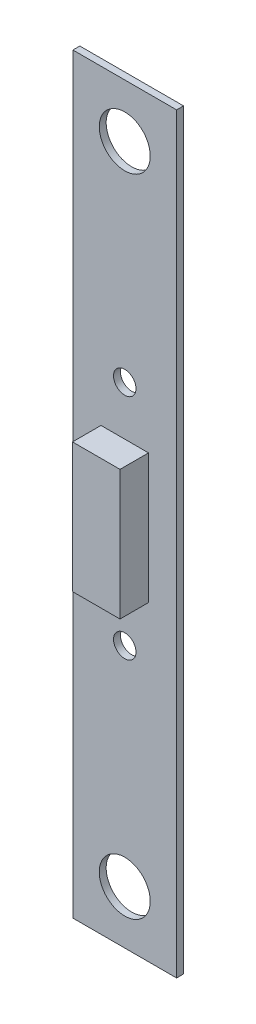
ISO-10303-21;
HEADER;
FILE_DESCRIPTION(('STEP AP214'),'2;1');
FILE_NAME('part.step','',(''),(''),'','','');
FILE_SCHEMA(('AUTOMOTIVE_DESIGN { 1 0 10303 214 1 1 1 1 }'));
ENDSEC;
DATA;
#1=APPLICATION_CONTEXT('core data for automotive mechanical design processes');
#2=APPLICATION_PROTOCOL_DEFINITION('international standard','automotive_design',2000,#1);
#3=PRODUCT_CONTEXT('',#1,'mechanical');
#4=PRODUCT('Part','Part','',(#3));
#5=PRODUCT_RELATED_PRODUCT_CATEGORY('part','',(#4));
#6=PRODUCT_DEFINITION_FORMATION('','',#4);
#7=PRODUCT_DEFINITION_CONTEXT('part definition',#1,'design');
#8=PRODUCT_DEFINITION('design','',#6,#7);
#9=PRODUCT_DEFINITION_SHAPE('','',#8);
#10=(LENGTH_UNIT() NAMED_UNIT(*) SI_UNIT(.MILLI.,.METRE.));
#11=(NAMED_UNIT(*) PLANE_ANGLE_UNIT() SI_UNIT($,.RADIAN.));
#12=(NAMED_UNIT(*) SI_UNIT($,.STERADIAN.) SOLID_ANGLE_UNIT());
#13=UNCERTAINTY_MEASURE_WITH_UNIT(LENGTH_MEASURE(1.E-05),#10,'distance_accuracy_value','');
#14=(GEOMETRIC_REPRESENTATION_CONTEXT(3) GLOBAL_UNCERTAINTY_ASSIGNED_CONTEXT((#13)) GLOBAL_UNIT_ASSIGNED_CONTEXT((#10,
#11,#12)) REPRESENTATION_CONTEXT('',''));
#15=CARTESIAN_POINT('',(0.,0.,0.));
#16=DIRECTION('',(0.,0.,1.));
#17=DIRECTION('',(1.,0.,0.));
#18=AXIS2_PLACEMENT_3D('',#15,#16,#17);
#19=CARTESIAN_POINT('',(0.,0.,4.1));
#20=DIRECTION('',(0.,0.,1.));
#21=DIRECTION('',(1.,0.,0.));
#22=AXIS2_PLACEMENT_3D('',#19,#20,#21);
#23=PLANE('',#22);
#24=DIRECTION('',(0.,1.,0.));
#25=VECTOR('',#24,1.);
#26=CARTESIAN_POINT('',(-2.75,7.5,4.1));
#27=LINE('',#26,#25);
#28=CARTESIAN_POINT('',(-2.75,-7.5,4.1));
#29=VERTEX_POINT('',#28);
#30=CARTESIAN_POINT('',(-2.75,7.5,4.1));
#31=VERTEX_POINT('',#30);
#32=EDGE_CURVE('E92',#29,#31,#27,.T.);
#33=ORIENTED_EDGE('',*,*,#32,.F.);
#34=DIRECTION('',(1.,0.,0.));
#35=VECTOR('',#34,1.);
#36=CARTESIAN_POINT('',(-2.75,-7.5,4.1));
#37=LINE('',#36,#35);
#38=CARTESIAN_POINT('',(2.75,-7.5,4.1));
#39=VERTEX_POINT('',#38);
#40=EDGE_CURVE('E172',#39,#29,#37,.F.);
#41=ORIENTED_EDGE('',*,*,#40,.F.);
#42=DIRECTION('',(0.,1.,0.));
#43=VECTOR('',#42,1.);
#44=CARTESIAN_POINT('',(2.75,-7.5,4.1));
#45=LINE('',#44,#43);
#46=CARTESIAN_POINT('',(2.75,7.5,4.1));
#47=VERTEX_POINT('',#46);
#48=EDGE_CURVE('E106',#47,#39,#45,.F.);
#49=ORIENTED_EDGE('',*,*,#48,.F.);
#50=DIRECTION('',(1.,0.,0.));
#51=VECTOR('',#50,1.);
#52=CARTESIAN_POINT('',(2.75,7.5,4.1));
#53=LINE('',#52,#51);
#54=EDGE_CURVE('E85',#31,#47,#53,.T.);
#55=ORIENTED_EDGE('',*,*,#54,.F.);
#56=EDGE_LOOP('',(#33,#41,#49,#55));
#57=FACE_BOUND('',#56,.T.);
#58=ADVANCED_FACE('F17',(#57),#23,.T.);
#59=CARTESIAN_POINT('',(-2.75,7.5,0.8));
#60=DIRECTION('',(-1.,0.,0.));
#61=DIRECTION('',(0.,0.,1.));
#62=AXIS2_PLACEMENT_3D('',#59,#60,#61);
#63=PLANE('',#62);
#64=DIRECTION('',(0.,0.,1.));
#65=VECTOR('',#64,1.);
#66=CARTESIAN_POINT('',(-2.75,7.5,0.8));
#67=LINE('',#66,#65);
#68=CARTESIAN_POINT('',(-2.75,7.5,0.8));
#69=VERTEX_POINT('',#68);
#70=EDGE_CURVE('E95',#69,#31,#67,.T.);
#71=ORIENTED_EDGE('',*,*,#70,.F.);
#72=DIRECTION('',(0.,1.,0.));
#73=VECTOR('',#72,1.);
#74=CARTESIAN_POINT('',(-2.75,0.,0.8));
#75=LINE('',#74,#73);
#76=CARTESIAN_POINT('',(-2.75,-7.5,0.8));
#77=VERTEX_POINT('',#76);
#78=EDGE_CURVE('E168',#77,#69,#75,.T.);
#79=ORIENTED_EDGE('',*,*,#78,.F.);
#80=DIRECTION('',(0.,0.,-1.));
#81=VECTOR('',#80,1.);
#82=CARTESIAN_POINT('',(-2.75,-7.5,0.8));
#83=LINE('',#82,#81);
#84=EDGE_CURVE('E97',#29,#77,#83,.T.);
#85=ORIENTED_EDGE('',*,*,#84,.F.);
#86=ORIENTED_EDGE('',*,*,#32,.T.);
#87=EDGE_LOOP('',(#71,#79,#85,#86));
#88=FACE_BOUND('',#87,.T.);
#89=ADVANCED_FACE('F93',(#88),#63,.T.);
#90=CARTESIAN_POINT('',(2.75,7.5,0.8));
#91=DIRECTION('',(0.,1.,0.));
#92=DIRECTION('',(0.,0.,1.));
#93=AXIS2_PLACEMENT_3D('',#90,#91,#92);
#94=PLANE('',#93);
#95=DIRECTION('',(0.,0.,-1.));
#96=VECTOR('',#95,1.);
#97=CARTESIAN_POINT('',(2.75,7.5,0.8));
#98=LINE('',#97,#96);
#99=CARTESIAN_POINT('',(2.75,7.5,0.8));
#100=VERTEX_POINT('',#99);
#101=EDGE_CURVE('E107',#100,#47,#98,.F.);
#102=ORIENTED_EDGE('',*,*,#101,.F.);
#103=DIRECTION('',(1.,0.,0.));
#104=VECTOR('',#103,1.);
#105=CARTESIAN_POINT('',(0.,7.5,0.8));
#106=LINE('',#105,#104);
#107=EDGE_CURVE('E103',#69,#100,#106,.T.);
#108=ORIENTED_EDGE('',*,*,#107,.F.);
#109=ORIENTED_EDGE('',*,*,#70,.T.);
#110=ORIENTED_EDGE('',*,*,#54,.T.);
#111=EDGE_LOOP('',(#102,#108,#109,#110));
#112=FACE_BOUND('',#111,.T.);
#113=ADVANCED_FACE('F102',(#112),#94,.T.);
#114=CARTESIAN_POINT('',(2.75,-7.5,0.8));
#115=DIRECTION('',(1.,0.,0.));
#116=DIRECTION('',(0.,0.,-1.));
#117=AXIS2_PLACEMENT_3D('',#114,#115,#116);
#118=PLANE('',#117);
#119=DIRECTION('',(0.,0.,-1.));
#120=VECTOR('',#119,1.);
#121=CARTESIAN_POINT('',(2.75,-7.5,0.8));
#122=LINE('',#121,#120);
#123=CARTESIAN_POINT('',(2.75,-7.5,0.8));
#124=VERTEX_POINT('',#123);
#125=EDGE_CURVE('E175',#124,#39,#122,.F.);
#126=ORIENTED_EDGE('',*,*,#125,.F.);
#127=DIRECTION('',(0.,1.,0.));
#128=VECTOR('',#127,1.);
#129=CARTESIAN_POINT('',(2.75,0.,0.8));
#130=LINE('',#129,#128);
#131=EDGE_CURVE('E164',#100,#124,#130,.F.);
#132=ORIENTED_EDGE('',*,*,#131,.F.);
#133=ORIENTED_EDGE('',*,*,#101,.T.);
#134=ORIENTED_EDGE('',*,*,#48,.T.);
#135=EDGE_LOOP('',(#126,#132,#133,#134));
#136=FACE_BOUND('',#135,.T.);
#137=ADVANCED_FACE('F181',(#136),#118,.T.);
#138=CARTESIAN_POINT('',(-2.75,-7.5,0.8));
#139=DIRECTION('',(0.,-1.,0.));
#140=DIRECTION('',(0.,0.,-1.));
#141=AXIS2_PLACEMENT_3D('',#138,#139,#140);
#142=PLANE('',#141);
#143=ORIENTED_EDGE('',*,*,#84,.T.);
#144=DIRECTION('',(1.,0.,0.));
#145=VECTOR('',#144,1.);
#146=CARTESIAN_POINT('',(0.,-7.5,0.8));
#147=LINE('',#146,#145);
#148=EDGE_CURVE('E160',#124,#77,#147,.F.);
#149=ORIENTED_EDGE('',*,*,#148,.F.);
#150=ORIENTED_EDGE('',*,*,#125,.T.);
#151=ORIENTED_EDGE('',*,*,#40,.T.);
#152=EDGE_LOOP('',(#143,#149,#150,#151));
#153=FACE_BOUND('',#152,.T.);
#154=ADVANCED_FACE('F185',(#153),#142,.T.);
#155=CARTESIAN_POINT('',(0.,0.,0.8));
#156=DIRECTION('',(0.,0.,1.));
#157=DIRECTION('',(1.,0.,0.));
#158=AXIS2_PLACEMENT_3D('',#155,#156,#157);
#159=PLANE('',#158);
#160=CARTESIAN_POINT('',(0.,37.3430081613,0.8));
#161=DIRECTION('',(0.,0.,1.));
#162=DIRECTION('',(1.,0.,0.));
#163=AXIS2_PLACEMENT_3D('',#160,#161,#162);
#164=CIRCLE('',#163,2.95);
#165=CARTESIAN_POINT('',(2.95000000000001,37.3430081613,0.8));
#166=VERTEX_POINT('',#165);
#167=EDGE_CURVE('E122',#166,#166,#164,.F.);
#168=ORIENTED_EDGE('',*,*,#167,.T.);
#169=EDGE_LOOP('',(#168));
#170=FACE_BOUND('',#169,.T.);
#171=CARTESIAN_POINT('',(0.,-37.34239737607,0.8));
#172=DIRECTION('',(0.,0.,1.));
#173=DIRECTION('',(1.,0.,0.));
#174=AXIS2_PLACEMENT_3D('',#171,#172,#173);
#175=CIRCLE('',#174,2.95);
#176=CARTESIAN_POINT('',(2.95000000000001,-37.34239737607,0.8));
#177=VERTEX_POINT('',#176);
#178=EDGE_CURVE('E127',#177,#177,#175,.F.);
#179=ORIENTED_EDGE('',*,*,#178,.T.);
#180=EDGE_LOOP('',(#179));
#181=FACE_BOUND('',#180,.T.);
#182=ORIENTED_EDGE('',*,*,#131,.T.);
#183=ORIENTED_EDGE('',*,*,#148,.T.);
#184=ORIENTED_EDGE('',*,*,#78,.T.);
#185=ORIENTED_EDGE('',*,*,#107,.T.);
#186=EDGE_LOOP('',(#182,#183,#184,#185));
#187=FACE_BOUND('',#186,.T.);
#188=CARTESIAN_POINT('',(0.,13.2,0.8));
#189=DIRECTION('',(0.,0.,1.));
#190=DIRECTION('',(1.,0.,0.));
#191=AXIS2_PLACEMENT_3D('',#188,#189,#190);
#192=CIRCLE('',#191,1.3);
#193=CARTESIAN_POINT('',(1.3,13.2,0.8));
#194=VERTEX_POINT('',#193);
#195=EDGE_CURVE('E129',#194,#194,#192,.F.);
#196=ORIENTED_EDGE('',*,*,#195,.T.);
#197=EDGE_LOOP('',(#196));
#198=FACE_BOUND('',#197,.T.);
#199=CARTESIAN_POINT('',(0.,-13.2,0.8));
#200=DIRECTION('',(0.,0.,1.));
#201=DIRECTION('',(1.,0.,0.));
#202=AXIS2_PLACEMENT_3D('',#199,#200,#201);
#203=CIRCLE('',#202,1.3);
#204=CARTESIAN_POINT('',(1.3,-13.2,0.8));
#205=VERTEX_POINT('',#204);
#206=EDGE_CURVE('E20',#205,#205,#203,.F.);
#207=ORIENTED_EDGE('',*,*,#206,.T.);
#208=EDGE_LOOP('',(#207));
#209=FACE_BOUND('',#208,.T.);
#210=DIRECTION('',(1.,0.,0.));
#211=VECTOR('',#210,1.);
#212=CARTESIAN_POINT('',(4.,43.5,0.8));
#213=LINE('',#212,#211);
#214=CARTESIAN_POINT('',(-6.,43.5,0.8));
#215=VERTEX_POINT('',#214);
#216=CARTESIAN_POINT('',(6.,43.5,0.8));
#217=VERTEX_POINT('',#216);
#218=EDGE_CURVE('E139',#215,#217,#213,.T.);
#219=ORIENTED_EDGE('',*,*,#218,.F.);
#220=DIRECTION('',(0.,1.,0.));
#221=VECTOR('',#220,1.);
#222=CARTESIAN_POINT('',(-6.,16.5,0.8));
#223=LINE('',#222,#221);
#224=CARTESIAN_POINT('',(-6.,-43.5,0.8));
#225=VERTEX_POINT('',#224);
#226=EDGE_CURVE('E157',#225,#215,#223,.T.);
#227=ORIENTED_EDGE('',*,*,#226,.F.);
#228=DIRECTION('',(1.,0.,0.));
#229=VECTOR('',#228,1.);
#230=CARTESIAN_POINT('',(-4.,-43.5,0.8));
#231=LINE('',#230,#229);
#232=CARTESIAN_POINT('',(6.,-43.5,0.8));
#233=VERTEX_POINT('',#232);
#234=EDGE_CURVE('E155',#233,#225,#231,.F.);
#235=ORIENTED_EDGE('',*,*,#234,.F.);
#236=DIRECTION('',(0.,1.,0.));
#237=VECTOR('',#236,1.);
#238=CARTESIAN_POINT('',(6.,-16.5,0.8));
#239=LINE('',#238,#237);
#240=EDGE_CURVE('E150',#217,#233,#239,.F.);
#241=ORIENTED_EDGE('',*,*,#240,.F.);
#242=EDGE_LOOP('',(#219,#227,#235,#241));
#243=FACE_BOUND('',#242,.T.);
#244=ADVANCED_FACE('F187',(#170,#181,#187,#198,#209,#243),#159,.T.);
#245=CARTESIAN_POINT('',(-6.,16.5,0.));
#246=DIRECTION('',(-1.,0.,0.));
#247=DIRECTION('',(0.,0.,1.));
#248=AXIS2_PLACEMENT_3D('',#245,#246,#247);
#249=PLANE('',#248);
#250=DIRECTION('',(0.,0.,1.));
#251=VECTOR('',#250,1.);
#252=CARTESIAN_POINT('',(-6.,43.5,0.));
#253=LINE('',#252,#251);
#254=CARTESIAN_POINT('',(-6.,43.5,0.));
#255=VERTEX_POINT('',#254);
#256=EDGE_CURVE('E141',#255,#215,#253,.T.);
#257=ORIENTED_EDGE('',*,*,#256,.F.);
#258=DIRECTION('',(0.,1.,0.));
#259=VECTOR('',#258,1.);
#260=CARTESIAN_POINT('',(-6.,0.,0.));
#261=LINE('',#260,#259);
#262=CARTESIAN_POINT('',(-6.,-43.5,0.));
#263=VERTEX_POINT('',#262);
#264=EDGE_CURVE('E126',#255,#263,#261,.F.);
#265=ORIENTED_EDGE('',*,*,#264,.T.);
#266=DIRECTION('',(0.,0.,-1.));
#267=VECTOR('',#266,1.);
#268=CARTESIAN_POINT('',(-6.,-43.5,0.));
#269=LINE('',#268,#267);
#270=EDGE_CURVE('E153',#225,#263,#269,.T.);
#271=ORIENTED_EDGE('',*,*,#270,.F.);
#272=ORIENTED_EDGE('',*,*,#226,.T.);
#273=EDGE_LOOP('',(#257,#265,#271,#272));
#274=FACE_BOUND('',#273,.T.);
#275=ADVANCED_FACE('F189',(#274),#249,.T.);
#276=CARTESIAN_POINT('',(-4.,-43.5,0.));
#277=DIRECTION('',(0.,-1.,0.));
#278=DIRECTION('',(0.,0.,-1.));
#279=AXIS2_PLACEMENT_3D('',#276,#277,#278);
#280=PLANE('',#279);
#281=ORIENTED_EDGE('',*,*,#270,.T.);
#282=DIRECTION('',(1.,0.,0.));
#283=VECTOR('',#282,1.);
#284=CARTESIAN_POINT('',(0.,-43.5,0.));
#285=LINE('',#284,#283);
#286=CARTESIAN_POINT('',(6.,-43.5,0.));
#287=VERTEX_POINT('',#286);
#288=EDGE_CURVE('E207',#263,#287,#285,.T.);
#289=ORIENTED_EDGE('',*,*,#288,.T.);
#290=DIRECTION('',(0.,0.,-1.));
#291=VECTOR('',#290,1.);
#292=CARTESIAN_POINT('',(6.,-43.5,0.));
#293=LINE('',#292,#291);
#294=EDGE_CURVE('E148',#233,#287,#293,.T.);
#295=ORIENTED_EDGE('',*,*,#294,.F.);
#296=ORIENTED_EDGE('',*,*,#234,.T.);
#297=EDGE_LOOP('',(#281,#289,#295,#296));
#298=FACE_BOUND('',#297,.T.);
#299=ADVANCED_FACE('F205',(#298),#280,.T.);
#300=CARTESIAN_POINT('',(6.,-16.5,0.));
#301=DIRECTION('',(1.,0.,0.));
#302=DIRECTION('',(0.,0.,-1.));
#303=AXIS2_PLACEMENT_3D('',#300,#301,#302);
#304=PLANE('',#303);
#305=ORIENTED_EDGE('',*,*,#294,.T.);
#306=DIRECTION('',(0.,1.,0.));
#307=VECTOR('',#306,1.);
#308=CARTESIAN_POINT('',(6.,0.,0.));
#309=LINE('',#308,#307);
#310=CARTESIAN_POINT('',(6.,43.5,0.));
#311=VERTEX_POINT('',#310);
#312=EDGE_CURVE('E212',#287,#311,#309,.T.);
#313=ORIENTED_EDGE('',*,*,#312,.T.);
#314=DIRECTION('',(0.,0.,1.));
#315=VECTOR('',#314,1.);
#316=CARTESIAN_POINT('',(6.,43.5,0.));
#317=LINE('',#316,#315);
#318=EDGE_CURVE('E36',#217,#311,#317,.F.);
#319=ORIENTED_EDGE('',*,*,#318,.F.);
#320=ORIENTED_EDGE('',*,*,#240,.T.);
#321=EDGE_LOOP('',(#305,#313,#319,#320));
#322=FACE_BOUND('',#321,.T.);
#323=ADVANCED_FACE('F220',(#322),#304,.T.);
#324=CARTESIAN_POINT('',(4.,43.5,0.));
#325=DIRECTION('',(0.,1.,0.));
#326=DIRECTION('',(0.,0.,1.));
#327=AXIS2_PLACEMENT_3D('',#324,#325,#326);
#328=PLANE('',#327);
#329=ORIENTED_EDGE('',*,*,#318,.T.);
#330=DIRECTION('',(1.,0.,0.));
#331=VECTOR('',#330,1.);
#332=CARTESIAN_POINT('',(0.,43.5,0.));
#333=LINE('',#332,#331);
#334=EDGE_CURVE('E121',#311,#255,#333,.F.);
#335=ORIENTED_EDGE('',*,*,#334,.T.);
#336=ORIENTED_EDGE('',*,*,#256,.T.);
#337=ORIENTED_EDGE('',*,*,#218,.T.);
#338=EDGE_LOOP('',(#329,#335,#336,#337));
#339=FACE_BOUND('',#338,.T.);
#340=ADVANCED_FACE('F198',(#339),#328,.T.);
#341=CARTESIAN_POINT('',(0.,-13.2,0.8));
#342=DIRECTION('',(0.,0.,1.));
#343=DIRECTION('',(1.,0.,0.));
#344=AXIS2_PLACEMENT_3D('',#341,#342,#343);
#345=CYLINDRICAL_SURFACE('',#344,1.3);
#346=ORIENTED_EDGE('',*,*,#206,.F.);
#347=EDGE_LOOP('',(#346));
#348=FACE_BOUND('',#347,.T.);
#349=CARTESIAN_POINT('',(0.,-13.2,0.));
#350=DIRECTION('',(0.,0.,1.));
#351=DIRECTION('',(1.,0.,0.));
#352=AXIS2_PLACEMENT_3D('',#349,#350,#351);
#353=CIRCLE('',#352,1.3);
#354=CARTESIAN_POINT('',(1.3,-13.2,0.));
#355=VERTEX_POINT('',#354);
#356=EDGE_CURVE('E117',#355,#355,#353,.F.);
#357=ORIENTED_EDGE('',*,*,#356,.T.);
#358=EDGE_LOOP('',(#357));
#359=FACE_BOUND('',#358,.T.);
#360=ADVANCED_FACE('F228',(#348,#359),#345,.F.);
#361=CARTESIAN_POINT('',(0.,13.2,0.8));
#362=DIRECTION('',(0.,0.,1.));
#363=DIRECTION('',(1.,0.,0.));
#364=AXIS2_PLACEMENT_3D('',#361,#362,#363);
#365=CYLINDRICAL_SURFACE('',#364,1.3);
#366=ORIENTED_EDGE('',*,*,#195,.F.);
#367=EDGE_LOOP('',(#366));
#368=FACE_BOUND('',#367,.T.);
#369=CARTESIAN_POINT('',(0.,13.2,0.));
#370=DIRECTION('',(0.,0.,1.));
#371=DIRECTION('',(1.,0.,0.));
#372=AXIS2_PLACEMENT_3D('',#369,#370,#371);
#373=CIRCLE('',#372,1.3);
#374=CARTESIAN_POINT('',(1.3,13.2,0.));
#375=VERTEX_POINT('',#374);
#376=EDGE_CURVE('E114',#375,#375,#373,.F.);
#377=ORIENTED_EDGE('',*,*,#376,.T.);
#378=EDGE_LOOP('',(#377));
#379=FACE_BOUND('',#378,.T.);
#380=ADVANCED_FACE('F246',(#368,#379),#365,.F.);
#381=CARTESIAN_POINT('',(0.,-37.34239737607,0.8));
#382=DIRECTION('',(0.,0.,1.));
#383=DIRECTION('',(1.,0.,0.));
#384=AXIS2_PLACEMENT_3D('',#381,#382,#383);
#385=CYLINDRICAL_SURFACE('',#384,2.95);
#386=ORIENTED_EDGE('',*,*,#178,.F.);
#387=EDGE_LOOP('',(#386));
#388=FACE_BOUND('',#387,.T.);
#389=CARTESIAN_POINT('',(0.,-37.34239737607,0.));
#390=DIRECTION('',(0.,0.,1.));
#391=DIRECTION('',(1.,0.,0.));
#392=AXIS2_PLACEMENT_3D('',#389,#390,#391);
#393=CIRCLE('',#392,2.95);
#394=CARTESIAN_POINT('',(2.95000000000001,-37.34239737607,0.));
#395=VERTEX_POINT('',#394);
#396=EDGE_CURVE('E27',#395,#395,#393,.F.);
#397=ORIENTED_EDGE('',*,*,#396,.T.);
#398=EDGE_LOOP('',(#397));
#399=FACE_BOUND('',#398,.T.);
#400=ADVANCED_FACE('F238',(#388,#399),#385,.F.);
#401=CARTESIAN_POINT('',(0.,37.3430081613,0.8));
#402=DIRECTION('',(0.,0.,1.));
#403=DIRECTION('',(1.,0.,0.));
#404=AXIS2_PLACEMENT_3D('',#401,#402,#403);
#405=CYLINDRICAL_SURFACE('',#404,2.95);
#406=ORIENTED_EDGE('',*,*,#167,.F.);
#407=EDGE_LOOP('',(#406));
#408=FACE_BOUND('',#407,.T.);
#409=CARTESIAN_POINT('',(0.,37.3430081613,0.));
#410=DIRECTION('',(0.,0.,1.));
#411=DIRECTION('',(1.,0.,0.));
#412=AXIS2_PLACEMENT_3D('',#409,#410,#411);
#413=CIRCLE('',#412,2.95);
#414=CARTESIAN_POINT('',(2.95000000000001,37.3430081613,0.));
#415=VERTEX_POINT('',#414);
#416=EDGE_CURVE('E11',#415,#415,#413,.F.);
#417=ORIENTED_EDGE('',*,*,#416,.T.);
#418=EDGE_LOOP('',(#417));
#419=FACE_BOUND('',#418,.T.);
#420=ADVANCED_FACE('F232',(#408,#419),#405,.F.);
#421=CARTESIAN_POINT('',(0.,0.,0.));
#422=DIRECTION('',(0.,0.,1.));
#423=DIRECTION('',(1.,0.,0.));
#424=AXIS2_PLACEMENT_3D('',#421,#422,#423);
#425=PLANE('',#424);
#426=ORIENTED_EDGE('',*,*,#416,.F.);
#427=EDGE_LOOP('',(#426));
#428=FACE_BOUND('',#427,.T.);
#429=ORIENTED_EDGE('',*,*,#396,.F.);
#430=EDGE_LOOP('',(#429));
#431=FACE_BOUND('',#430,.T.);
#432=ORIENTED_EDGE('',*,*,#376,.F.);
#433=EDGE_LOOP('',(#432));
#434=FACE_BOUND('',#433,.T.);
#435=ORIENTED_EDGE('',*,*,#356,.F.);
#436=EDGE_LOOP('',(#435));
#437=FACE_BOUND('',#436,.T.);
#438=ORIENTED_EDGE('',*,*,#312,.F.);
#439=ORIENTED_EDGE('',*,*,#288,.F.);
#440=ORIENTED_EDGE('',*,*,#264,.F.);
#441=ORIENTED_EDGE('',*,*,#334,.F.);
#442=EDGE_LOOP('',(#438,#439,#440,#441));
#443=FACE_BOUND('',#442,.T.);
#444=ADVANCED_FACE('F210',(#428,#431,#434,#437,#443),#425,.F.);
#445=CLOSED_SHELL('',(#58,#89,#113,#137,#154,#244,#275,#299,#323,#340,#360,#380,#400,#420,#444));
#446=MANIFOLD_SOLID_BREP('B1',#445);
#447=ADVANCED_BREP_SHAPE_REPRESENTATION('',(#18,#446),#14);
#448=SHAPE_DEFINITION_REPRESENTATION(#9,#447);
ENDSEC;
END-ISO-10303-21;
